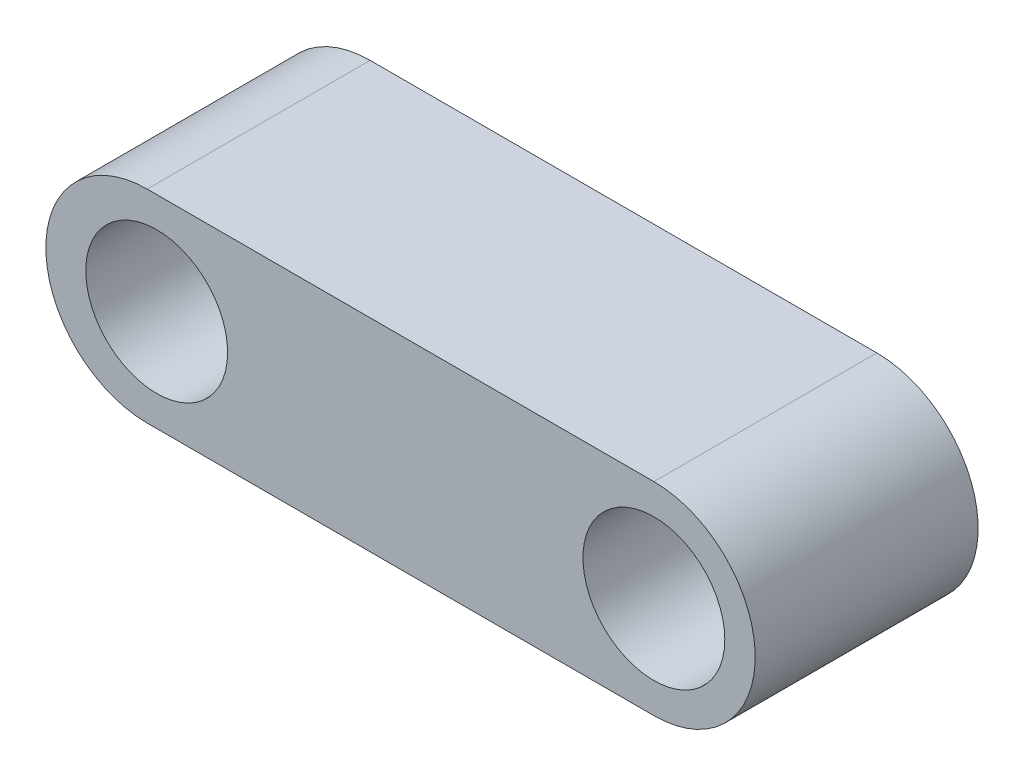
ISO-10303-21;
HEADER;
FILE_DESCRIPTION(('STEP AP214'),'2;1');
FILE_NAME('part.step','',(''),(''),'','','');
FILE_SCHEMA(('AUTOMOTIVE_DESIGN { 1 0 10303 214 1 1 1 1 }'));
ENDSEC;
DATA;
#1=APPLICATION_CONTEXT('core data for automotive mechanical design processes');
#2=APPLICATION_PROTOCOL_DEFINITION('international standard','automotive_design',2000,#1);
#3=PRODUCT_CONTEXT('',#1,'mechanical');
#4=PRODUCT('Part','Part','',(#3));
#5=PRODUCT_RELATED_PRODUCT_CATEGORY('part','',(#4));
#6=PRODUCT_DEFINITION_FORMATION('','',#4);
#7=PRODUCT_DEFINITION_CONTEXT('part definition',#1,'design');
#8=PRODUCT_DEFINITION('design','',#6,#7);
#9=PRODUCT_DEFINITION_SHAPE('','',#8);
#10=(LENGTH_UNIT() NAMED_UNIT(*) SI_UNIT(.MILLI.,.METRE.));
#11=(NAMED_UNIT(*) PLANE_ANGLE_UNIT() SI_UNIT($,.RADIAN.));
#12=(NAMED_UNIT(*) SI_UNIT($,.STERADIAN.) SOLID_ANGLE_UNIT());
#13=UNCERTAINTY_MEASURE_WITH_UNIT(LENGTH_MEASURE(1.E-05),#10,'distance_accuracy_value','');
#14=(GEOMETRIC_REPRESENTATION_CONTEXT(3) GLOBAL_UNCERTAINTY_ASSIGNED_CONTEXT((#13)) GLOBAL_UNIT_ASSIGNED_CONTEXT((#10,
#11,#12)) REPRESENTATION_CONTEXT('',''));
#15=CARTESIAN_POINT('',(0.,0.,0.));
#16=DIRECTION('',(0.,0.,1.));
#17=DIRECTION('',(1.,0.,0.));
#18=AXIS2_PLACEMENT_3D('',#15,#16,#17);
#19=CARTESIAN_POINT('',(25.,-5.,0.));
#20=DIRECTION('',(0.,0.,1.));
#21=DIRECTION('',(1.,0.,0.));
#22=AXIS2_PLACEMENT_3D('',#19,#20,#21);
#23=PLANE('',#22);
#24=CARTESIAN_POINT('',(25.,-5.,0.));
#25=DIRECTION('',(0.,0.,1.));
#26=DIRECTION('',(1.,0.,0.));
#27=AXIS2_PLACEMENT_3D('',#24,#25,#26);
#28=CIRCLE('',#27,3.5);
#29=CARTESIAN_POINT('',(28.5,-5.,0.));
#30=VERTEX_POINT('',#29);
#31=EDGE_CURVE('E136',#30,#30,#28,.F.);
#32=ORIENTED_EDGE('',*,*,#31,.F.);
#33=EDGE_LOOP('',(#32));
#34=FACE_BOUND('',#33,.T.);
#35=CARTESIAN_POINT('',(0.469346028258411,-5.,0.));
#36=DIRECTION('',(0.,0.,1.));
#37=DIRECTION('',(1.,0.,0.));
#38=AXIS2_PLACEMENT_3D('',#35,#36,#37);
#39=CIRCLE('',#38,3.5);
#40=CARTESIAN_POINT('',(3.96934602825841,-5.,0.));
#41=VERTEX_POINT('',#40);
#42=EDGE_CURVE('E209',#41,#41,#39,.F.);
#43=ORIENTED_EDGE('',*,*,#42,.F.);
#44=EDGE_LOOP('',(#43));
#45=FACE_BOUND('',#44,.T.);
#46=CARTESIAN_POINT('',(25.,-5.,0.));
#47=DIRECTION('',(0.,0.,1.));
#48=DIRECTION('',(1.,0.,0.));
#49=AXIS2_PLACEMENT_3D('',#46,#47,#48);
#50=CIRCLE('',#49,5.);
#51=CARTESIAN_POINT('',(25.,-10.,0.));
#52=VERTEX_POINT('',#51);
#53=CARTESIAN_POINT('',(25.,0.,0.));
#54=VERTEX_POINT('',#53);
#55=EDGE_CURVE('E138',#52,#54,#50,.T.);
#56=ORIENTED_EDGE('',*,*,#55,.F.);
#57=DIRECTION('',(1.,0.,0.));
#58=VECTOR('',#57,1.);
#59=CARTESIAN_POINT('',(0.,-10.,0.));
#60=LINE('',#59,#58);
#61=CARTESIAN_POINT('',(0.,-10.,0.));
#62=VERTEX_POINT('',#61);
#63=EDGE_CURVE('E124',#62,#52,#60,.T.);
#64=ORIENTED_EDGE('',*,*,#63,.F.);
#65=CARTESIAN_POINT('',(0.,-5.,0.));
#66=DIRECTION('',(0.,0.,1.));
#67=DIRECTION('',(1.,0.,0.));
#68=AXIS2_PLACEMENT_3D('',#65,#66,#67);
#69=CIRCLE('',#68,5.);
#70=CARTESIAN_POINT('',(0.,0.,0.));
#71=VERTEX_POINT('',#70);
#72=EDGE_CURVE('E85',#71,#62,#69,.T.);
#73=ORIENTED_EDGE('',*,*,#72,.F.);
#74=DIRECTION('',(1.,0.,0.));
#75=VECTOR('',#74,1.);
#76=CARTESIAN_POINT('',(0.,0.,0.));
#77=LINE('',#76,#75);
#78=EDGE_CURVE('E140',#71,#54,#77,.T.);
#79=ORIENTED_EDGE('',*,*,#78,.T.);
#80=EDGE_LOOP('',(#56,#64,#73,#79));
#81=FACE_BOUND('',#80,.T.);
#82=ADVANCED_FACE('F81',(#34,#45,#81),#23,.F.);
#83=CARTESIAN_POINT('',(25.,-5.,11.));
#84=DIRECTION('',(0.,0.,1.));
#85=DIRECTION('',(1.,0.,0.));
#86=AXIS2_PLACEMENT_3D('',#83,#84,#85);
#87=PLANE('',#86);
#88=CARTESIAN_POINT('',(25.,-5.,11.));
#89=DIRECTION('',(0.,0.,1.));
#90=DIRECTION('',(1.,0.,0.));
#91=AXIS2_PLACEMENT_3D('',#88,#89,#90);
#92=CIRCLE('',#91,3.5);
#93=CARTESIAN_POINT('',(28.5,-5.,11.));
#94=VERTEX_POINT('',#93);
#95=EDGE_CURVE('E201',#94,#94,#92,.T.);
#96=ORIENTED_EDGE('',*,*,#95,.F.);
#97=EDGE_LOOP('',(#96));
#98=FACE_BOUND('',#97,.T.);
#99=CARTESIAN_POINT('',(0.469346028258411,-5.,11.));
#100=DIRECTION('',(0.,0.,1.));
#101=DIRECTION('',(1.,0.,0.));
#102=AXIS2_PLACEMENT_3D('',#99,#100,#101);
#103=CIRCLE('',#102,3.5);
#104=CARTESIAN_POINT('',(3.96934602825841,-5.,11.));
#105=VERTEX_POINT('',#104);
#106=EDGE_CURVE('E203',#105,#105,#103,.T.);
#107=ORIENTED_EDGE('',*,*,#106,.F.);
#108=EDGE_LOOP('',(#107));
#109=FACE_BOUND('',#108,.T.);
#110=CARTESIAN_POINT('',(25.,-5.,11.));
#111=DIRECTION('',(0.,0.,1.));
#112=DIRECTION('',(1.,0.,0.));
#113=AXIS2_PLACEMENT_3D('',#110,#111,#112);
#114=CIRCLE('',#113,5.);
#115=CARTESIAN_POINT('',(25.,-10.,11.));
#116=VERTEX_POINT('',#115);
#117=CARTESIAN_POINT('',(25.,0.,11.));
#118=VERTEX_POINT('',#117);
#119=EDGE_CURVE('E150',#116,#118,#114,.T.);
#120=ORIENTED_EDGE('',*,*,#119,.T.);
#121=DIRECTION('',(1.,0.,0.));
#122=VECTOR('',#121,1.);
#123=CARTESIAN_POINT('',(0.,0.,11.));
#124=LINE('',#123,#122);
#125=CARTESIAN_POINT('',(0.,0.,11.));
#126=VERTEX_POINT('',#125);
#127=EDGE_CURVE('E129',#126,#118,#124,.T.);
#128=ORIENTED_EDGE('',*,*,#127,.F.);
#129=CARTESIAN_POINT('',(0.,-5.,11.));
#130=DIRECTION('',(0.,0.,1.));
#131=DIRECTION('',(1.,0.,0.));
#132=AXIS2_PLACEMENT_3D('',#129,#130,#131);
#133=CIRCLE('',#132,5.);
#134=CARTESIAN_POINT('',(0.,-10.,11.));
#135=VERTEX_POINT('',#134);
#136=EDGE_CURVE('E135',#126,#135,#133,.T.);
#137=ORIENTED_EDGE('',*,*,#136,.T.);
#138=DIRECTION('',(1.,0.,0.));
#139=VECTOR('',#138,1.);
#140=CARTESIAN_POINT('',(0.,-10.,11.));
#141=LINE('',#140,#139);
#142=EDGE_CURVE('E126',#135,#116,#141,.T.);
#143=ORIENTED_EDGE('',*,*,#142,.T.);
#144=EDGE_LOOP('',(#120,#128,#137,#143));
#145=FACE_BOUND('',#144,.T.);
#146=ADVANCED_FACE('F167',(#98,#109,#145),#87,.T.);
#147=CARTESIAN_POINT('',(25.,-5.,11.));
#148=DIRECTION('',(0.,0.,-1.));
#149=DIRECTION('',(-1.,0.,0.));
#150=AXIS2_PLACEMENT_3D('',#147,#148,#149);
#151=CYLINDRICAL_SURFACE('',#150,5.);
#152=DIRECTION('',(0.,0.,-1.));
#153=VECTOR('',#152,1.);
#154=CARTESIAN_POINT('',(25.,0.,11.));
#155=LINE('',#154,#153);
#156=EDGE_CURVE('E12',#118,#54,#155,.T.);
#157=ORIENTED_EDGE('',*,*,#156,.F.);
#158=ORIENTED_EDGE('',*,*,#119,.F.);
#159=DIRECTION('',(0.,0.,-1.));
#160=VECTOR('',#159,1.);
#161=CARTESIAN_POINT('',(25.,-10.,11.));
#162=LINE('',#161,#160);
#163=EDGE_CURVE('E92',#116,#52,#162,.T.);
#164=ORIENTED_EDGE('',*,*,#163,.T.);
#165=ORIENTED_EDGE('',*,*,#55,.T.);
#166=EDGE_LOOP('',(#157,#158,#164,#165));
#167=FACE_BOUND('',#166,.T.);
#168=ADVANCED_FACE('F168',(#167),#151,.T.);
#169=CARTESIAN_POINT('',(0.,-5.,11.));
#170=DIRECTION('',(0.,0.,-1.));
#171=DIRECTION('',(-1.,0.,0.));
#172=AXIS2_PLACEMENT_3D('',#169,#170,#171);
#173=CYLINDRICAL_SURFACE('',#172,5.);
#174=ORIENTED_EDGE('',*,*,#72,.T.);
#175=DIRECTION('',(0.,0.,-1.));
#176=VECTOR('',#175,1.);
#177=CARTESIAN_POINT('',(0.,-10.,11.));
#178=LINE('',#177,#176);
#179=EDGE_CURVE('E121',#135,#62,#178,.T.);
#180=ORIENTED_EDGE('',*,*,#179,.F.);
#181=ORIENTED_EDGE('',*,*,#136,.F.);
#182=DIRECTION('',(0.,0.,-1.));
#183=VECTOR('',#182,1.);
#184=CARTESIAN_POINT('',(0.,0.,11.));
#185=LINE('',#184,#183);
#186=EDGE_CURVE('E118',#126,#71,#185,.T.);
#187=ORIENTED_EDGE('',*,*,#186,.T.);
#188=EDGE_LOOP('',(#174,#180,#181,#187));
#189=FACE_BOUND('',#188,.T.);
#190=ADVANCED_FACE('F83',(#189),#173,.T.);
#191=CARTESIAN_POINT('',(0.,-10.,11.));
#192=DIRECTION('',(0.,1.,0.));
#193=DIRECTION('',(-1.,0.,0.));
#194=AXIS2_PLACEMENT_3D('',#191,#192,#193);
#195=PLANE('',#194);
#196=ORIENTED_EDGE('',*,*,#63,.T.);
#197=ORIENTED_EDGE('',*,*,#163,.F.);
#198=ORIENTED_EDGE('',*,*,#142,.F.);
#199=ORIENTED_EDGE('',*,*,#179,.T.);
#200=EDGE_LOOP('',(#196,#197,#198,#199));
#201=FACE_BOUND('',#200,.T.);
#202=ADVANCED_FACE('F122',(#201),#195,.F.);
#203=CARTESIAN_POINT('',(0.,0.,11.));
#204=DIRECTION('',(0.,1.,0.));
#205=DIRECTION('',(0.,0.,1.));
#206=AXIS2_PLACEMENT_3D('',#203,#204,#205);
#207=PLANE('',#206);
#208=ORIENTED_EDGE('',*,*,#78,.F.);
#209=ORIENTED_EDGE('',*,*,#186,.F.);
#210=ORIENTED_EDGE('',*,*,#127,.T.);
#211=ORIENTED_EDGE('',*,*,#156,.T.);
#212=EDGE_LOOP('',(#208,#209,#210,#211));
#213=FACE_BOUND('',#212,.T.);
#214=ADVANCED_FACE('F166',(#213),#207,.T.);
#215=CARTESIAN_POINT('',(0.469346028258411,-5.,-9.89949493661166));
#216=DIRECTION('',(0.,0.,1.));
#217=DIRECTION('',(1.,0.,0.));
#218=AXIS2_PLACEMENT_3D('',#215,#216,#217);
#219=CYLINDRICAL_SURFACE('',#218,3.5);
#220=ORIENTED_EDGE('',*,*,#42,.T.);
#221=EDGE_LOOP('',(#220));
#222=FACE_BOUND('',#221,.T.);
#223=ORIENTED_EDGE('',*,*,#106,.T.);
#224=EDGE_LOOP('',(#223));
#225=FACE_BOUND('',#224,.T.);
#226=ADVANCED_FACE('F178',(#222,#225),#219,.F.);
#227=CARTESIAN_POINT('',(25.,-5.,-9.89949493661166));
#228=DIRECTION('',(0.,0.,1.));
#229=DIRECTION('',(1.,0.,0.));
#230=AXIS2_PLACEMENT_3D('',#227,#228,#229);
#231=CYLINDRICAL_SURFACE('',#230,3.5);
#232=ORIENTED_EDGE('',*,*,#31,.T.);
#233=EDGE_LOOP('',(#232));
#234=FACE_BOUND('',#233,.T.);
#235=ORIENTED_EDGE('',*,*,#95,.T.);
#236=EDGE_LOOP('',(#235));
#237=FACE_BOUND('',#236,.T.);
#238=ADVANCED_FACE('F191',(#234,#237),#231,.F.);
#239=CLOSED_SHELL('',(#82,#146,#168,#190,#202,#214,#226,#238));
#240=MANIFOLD_SOLID_BREP('B2',#239);
#241=ADVANCED_BREP_SHAPE_REPRESENTATION('',(#18,#240),#14);
#242=SHAPE_DEFINITION_REPRESENTATION(#9,#241);
ENDSEC;
END-ISO-10303-21;
